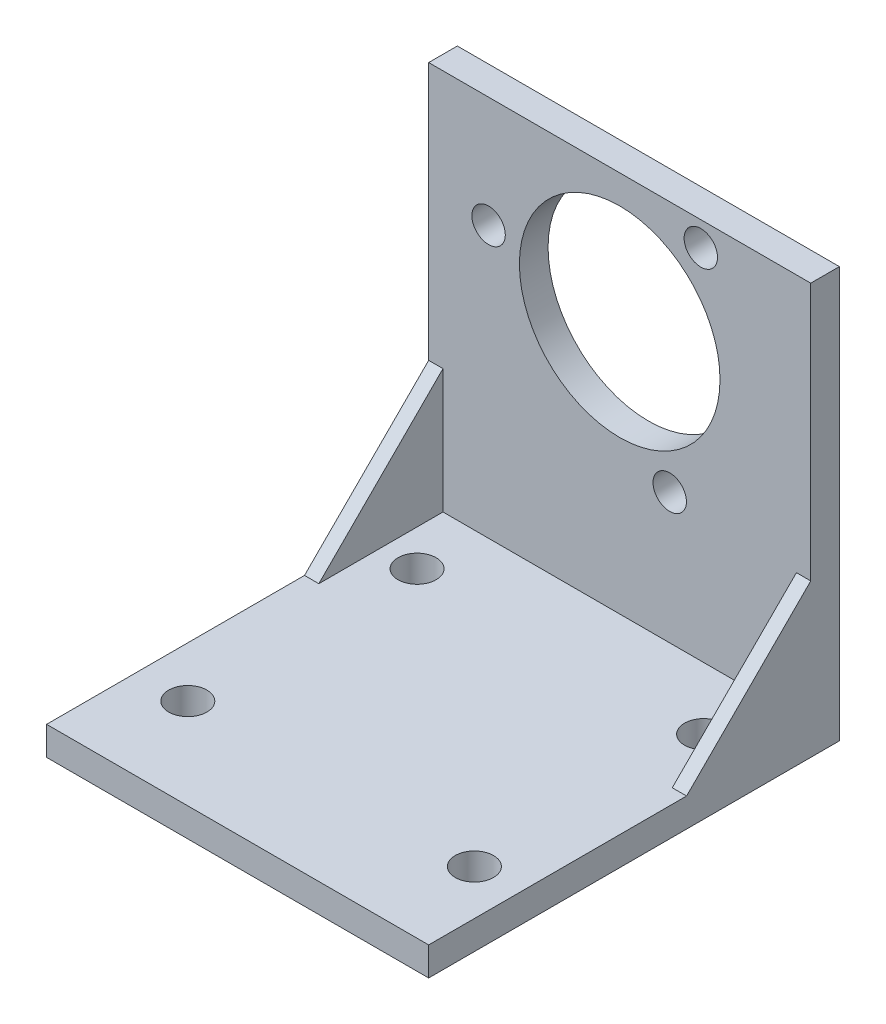
ISO-10303-21;
HEADER;
FILE_DESCRIPTION(('STEP AP214'),'2;1');
FILE_NAME('part.step','',(''),(''),'','','');
FILE_SCHEMA(('AUTOMOTIVE_DESIGN { 1 0 10303 214 1 1 1 1 }'));
ENDSEC;
DATA;
#1=APPLICATION_CONTEXT('core data for automotive mechanical design processes');
#2=APPLICATION_PROTOCOL_DEFINITION('international standard','automotive_design',2000,#1);
#3=PRODUCT_CONTEXT('',#1,'mechanical');
#4=PRODUCT('Part','Part','',(#3));
#5=PRODUCT_RELATED_PRODUCT_CATEGORY('part','',(#4));
#6=PRODUCT_DEFINITION_FORMATION('','',#4);
#7=PRODUCT_DEFINITION_CONTEXT('part definition',#1,'design');
#8=PRODUCT_DEFINITION('design','',#6,#7);
#9=PRODUCT_DEFINITION_SHAPE('','',#8);
#10=(LENGTH_UNIT() NAMED_UNIT(*) SI_UNIT(.MILLI.,.METRE.));
#11=(NAMED_UNIT(*) PLANE_ANGLE_UNIT() SI_UNIT($,.RADIAN.));
#12=(NAMED_UNIT(*) SI_UNIT($,.STERADIAN.) SOLID_ANGLE_UNIT());
#13=UNCERTAINTY_MEASURE_WITH_UNIT(LENGTH_MEASURE(1.E-05),#10,'distance_accuracy_value','');
#14=(GEOMETRIC_REPRESENTATION_CONTEXT(3) GLOBAL_UNCERTAINTY_ASSIGNED_CONTEXT((#13)) GLOBAL_UNIT_ASSIGNED_CONTEXT((#10,
#11,#12)) REPRESENTATION_CONTEXT('',''));
#15=CARTESIAN_POINT('',(0.,0.,0.));
#16=DIRECTION('',(0.,0.,1.));
#17=DIRECTION('',(1.,0.,0.));
#18=AXIS2_PLACEMENT_3D('',#15,#16,#17);
#19=CARTESIAN_POINT('',(0.,-3.,21.5));
#20=DIRECTION('',(0.,0.,1.));
#21=DIRECTION('',(1.,0.,0.));
#22=AXIS2_PLACEMENT_3D('',#19,#20,#21);
#23=PLANE('',#22);
#24=DIRECTION('',(1.,0.,0.));
#25=VECTOR('',#24,1.);
#26=CARTESIAN_POINT('',(0.,0.,21.5));
#27=LINE('',#26,#25);
#28=CARTESIAN_POINT('',(-20.,0.,21.5));
#29=VERTEX_POINT('',#28);
#30=CARTESIAN_POINT('',(20.,0.,21.5));
#31=VERTEX_POINT('',#30);
#32=EDGE_CURVE('E236',#29,#31,#27,.T.);
#33=ORIENTED_EDGE('',*,*,#32,.F.);
#34=DIRECTION('',(0.,1.,0.));
#35=VECTOR('',#34,1.);
#36=CARTESIAN_POINT('',(-20.,-3.,21.5));
#37=LINE('',#36,#35);
#38=CARTESIAN_POINT('',(-20.,-3.,21.5));
#39=VERTEX_POINT('',#38);
#40=EDGE_CURVE('E12',#39,#29,#37,.T.);
#41=ORIENTED_EDGE('',*,*,#40,.F.);
#42=DIRECTION('',(1.,0.,0.));
#43=VECTOR('',#42,1.);
#44=CARTESIAN_POINT('',(0.,-3.,21.5));
#45=LINE('',#44,#43);
#46=CARTESIAN_POINT('',(20.,-3.,21.5));
#47=VERTEX_POINT('',#46);
#48=EDGE_CURVE('E214',#39,#47,#45,.T.);
#49=ORIENTED_EDGE('',*,*,#48,.T.);
#50=DIRECTION('',(0.,1.,0.));
#51=VECTOR('',#50,1.);
#52=CARTESIAN_POINT('',(20.,-3.,21.5));
#53=LINE('',#52,#51);
#54=EDGE_CURVE('E54',#47,#31,#53,.T.);
#55=ORIENTED_EDGE('',*,*,#54,.T.);
#56=EDGE_LOOP('',(#33,#41,#49,#55));
#57=FACE_BOUND('',#56,.T.);
#58=ADVANCED_FACE('F50',(#57),#23,.T.);
#59=CARTESIAN_POINT('',(-20.,-3.,0.));
#60=DIRECTION('',(1.,0.,0.));
#61=DIRECTION('',(0.,0.,-1.));
#62=AXIS2_PLACEMENT_3D('',#59,#60,#61);
#63=PLANE('',#62);
#64=DIRECTION('',(0.,0.,-1.));
#65=VECTOR('',#64,1.);
#66=CARTESIAN_POINT('',(-20.,0.,0.));
#67=LINE('',#66,#65);
#68=CARTESIAN_POINT('',(-20.,0.,-5.5));
#69=VERTEX_POINT('',#68);
#70=EDGE_CURVE('E205',#29,#69,#67,.T.);
#71=ORIENTED_EDGE('',*,*,#70,.T.);
#72=DIRECTION('',(0.,0.707106781186547,-0.707106781186547));
#73=VECTOR('',#72,1.);
#74=CARTESIAN_POINT('',(-20.,13.,-18.5));
#75=LINE('',#74,#73);
#76=CARTESIAN_POINT('',(-20.,13.,-18.5));
#77=VERTEX_POINT('',#76);
#78=EDGE_CURVE('E257',#69,#77,#75,.T.);
#79=ORIENTED_EDGE('',*,*,#78,.T.);
#80=DIRECTION('',(0.,-1.,0.));
#81=VECTOR('',#80,1.);
#82=CARTESIAN_POINT('',(-20.,40.,-18.5));
#83=LINE('',#82,#81);
#84=CARTESIAN_POINT('',(-20.,40.,-18.5));
#85=VERTEX_POINT('',#84);
#86=EDGE_CURVE('E198',#85,#77,#83,.T.);
#87=ORIENTED_EDGE('',*,*,#86,.F.);
#88=DIRECTION('',(0.,0.,1.));
#89=VECTOR('',#88,1.);
#90=CARTESIAN_POINT('',(-20.,40.,0.));
#91=LINE('',#90,#89);
#92=CARTESIAN_POINT('',(-20.,40.,-21.5));
#93=VERTEX_POINT('',#92);
#94=EDGE_CURVE('E135',#93,#85,#91,.T.);
#95=ORIENTED_EDGE('',*,*,#94,.F.);
#96=DIRECTION('',(0.,1.,0.));
#97=VECTOR('',#96,1.);
#98=CARTESIAN_POINT('',(-20.,-3.,-21.5));
#99=LINE('',#98,#97);
#100=CARTESIAN_POINT('',(-20.,-3.,-21.5));
#101=VERTEX_POINT('',#100);
#102=EDGE_CURVE('E59',#101,#93,#99,.T.);
#103=ORIENTED_EDGE('',*,*,#102,.F.);
#104=DIRECTION('',(0.,0.,-1.));
#105=VECTOR('',#104,1.);
#106=CARTESIAN_POINT('',(-20.,-3.,0.));
#107=LINE('',#106,#105);
#108=EDGE_CURVE('E222',#39,#101,#107,.T.);
#109=ORIENTED_EDGE('',*,*,#108,.F.);
#110=ORIENTED_EDGE('',*,*,#40,.T.);
#111=EDGE_LOOP('',(#71,#79,#87,#95,#103,#109,#110));
#112=FACE_BOUND('',#111,.T.);
#113=ADVANCED_FACE('F255',(#112),#63,.F.);
#114=CARTESIAN_POINT('',(0.,-3.,-21.5));
#115=DIRECTION('',(0.,0.,1.));
#116=DIRECTION('',(1.,0.,0.));
#117=AXIS2_PLACEMENT_3D('',#114,#115,#116);
#118=PLANE('',#117);
#119=CARTESIAN_POINT('',(5.23636965743753,13.671109447397,-21.5));
#120=DIRECTION('',(0.,0.,1.));
#121=DIRECTION('',(1.,0.,0.));
#122=AXIS2_PLACEMENT_3D('',#119,#120,#121);
#123=CIRCLE('',#122,1.75);
#124=CARTESIAN_POINT('',(6.98636965743753,13.671109447397,-21.5));
#125=VERTEX_POINT('',#124);
#126=EDGE_CURVE('E136',#125,#125,#123,.T.);
#127=ORIENTED_EDGE('',*,*,#126,.T.);
#128=EDGE_LOOP('',(#127));
#129=FACE_BOUND('',#128,.T.);
#130=CARTESIAN_POINT('',(8.49196029220565,37.4492744232484,-21.5));
#131=DIRECTION('',(0.,0.,1.));
#132=DIRECTION('',(1.,0.,0.));
#133=AXIS2_PLACEMENT_3D('',#130,#131,#132);
#134=CIRCLE('',#133,1.75);
#135=CARTESIAN_POINT('',(10.2419602922057,37.4492744232484,-21.5));
#136=VERTEX_POINT('',#135);
#137=EDGE_CURVE('E180',#136,#136,#134,.T.);
#138=ORIENTED_EDGE('',*,*,#137,.T.);
#139=EDGE_LOOP('',(#138));
#140=FACE_BOUND('',#139,.T.);
#141=CARTESIAN_POINT('',(-13.7283299496432,28.3796161293546,-21.5));
#142=DIRECTION('',(0.,0.,1.));
#143=DIRECTION('',(1.,0.,0.));
#144=AXIS2_PLACEMENT_3D('',#141,#142,#143);
#145=CIRCLE('',#144,1.75);
#146=CARTESIAN_POINT('',(-11.9783299496432,28.3796161293546,-21.5));
#147=VERTEX_POINT('',#146);
#148=EDGE_CURVE('E177',#147,#147,#145,.T.);
#149=ORIENTED_EDGE('',*,*,#148,.T.);
#150=EDGE_LOOP('',(#149));
#151=FACE_BOUND('',#150,.T.);
#152=CARTESIAN_POINT('',(0.,26.5,-21.5));
#153=DIRECTION('',(0.,0.,1.));
#154=DIRECTION('',(1.,0.,0.));
#155=AXIS2_PLACEMENT_3D('',#152,#153,#154);
#156=CIRCLE('',#155,10.5);
#157=CARTESIAN_POINT('',(10.5,26.5,-21.5));
#158=VERTEX_POINT('',#157);
#159=EDGE_CURVE('E174',#158,#158,#156,.T.);
#160=ORIENTED_EDGE('',*,*,#159,.T.);
#161=EDGE_LOOP('',(#160));
#162=FACE_BOUND('',#161,.T.);
#163=ORIENTED_EDGE('',*,*,#102,.T.);
#164=DIRECTION('',(-1.,0.,0.));
#165=VECTOR('',#164,1.);
#166=CARTESIAN_POINT('',(0.,40.,-21.5));
#167=LINE('',#166,#165);
#168=CARTESIAN_POINT('',(20.,40.,-21.5));
#169=VERTEX_POINT('',#168);
#170=EDGE_CURVE('E192',#169,#93,#167,.T.);
#171=ORIENTED_EDGE('',*,*,#170,.F.);
#172=DIRECTION('',(0.,1.,0.));
#173=VECTOR('',#172,1.);
#174=CARTESIAN_POINT('',(20.,-3.,-21.5));
#175=LINE('',#174,#173);
#176=CARTESIAN_POINT('',(20.,-3.,-21.5));
#177=VERTEX_POINT('',#176);
#178=EDGE_CURVE('E242',#177,#169,#175,.T.);
#179=ORIENTED_EDGE('',*,*,#178,.F.);
#180=DIRECTION('',(1.,0.,0.));
#181=VECTOR('',#180,1.);
#182=CARTESIAN_POINT('',(0.,-3.,-21.5));
#183=LINE('',#182,#181);
#184=EDGE_CURVE('E220',#101,#177,#183,.T.);
#185=ORIENTED_EDGE('',*,*,#184,.F.);
#186=EDGE_LOOP('',(#163,#171,#179,#185));
#187=FACE_BOUND('',#186,.T.);
#188=ADVANCED_FACE('F283',(#129,#140,#151,#162,#187),#118,.F.);
#189=CARTESIAN_POINT('',(-14.7150530034863,-3.,-12.));
#190=DIRECTION('',(0.,1.,0.));
#191=DIRECTION('',(0.,0.,1.));
#192=AXIS2_PLACEMENT_3D('',#189,#190,#191);
#193=CYLINDRICAL_SURFACE('',#192,2.);
#194=CARTESIAN_POINT('',(-14.7150530034863,-3.,-12.));
#195=DIRECTION('',(0.,1.,0.));
#196=DIRECTION('',(0.,0.,1.));
#197=AXIS2_PLACEMENT_3D('',#194,#195,#196);
#198=CIRCLE('',#197,2.);
#199=CARTESIAN_POINT('',(-14.7150530034863,-3.,-10.));
#200=VERTEX_POINT('',#199);
#201=EDGE_CURVE('E211',#200,#200,#198,.T.);
#202=ORIENTED_EDGE('',*,*,#201,.F.);
#203=EDGE_LOOP('',(#202));
#204=FACE_BOUND('',#203,.T.);
#205=CARTESIAN_POINT('',(-14.7150530034863,0.,-12.));
#206=DIRECTION('',(0.,1.,0.));
#207=DIRECTION('',(0.,0.,1.));
#208=AXIS2_PLACEMENT_3D('',#205,#206,#207);
#209=CIRCLE('',#208,2.);
#210=CARTESIAN_POINT('',(-14.7150530034863,0.,-10.));
#211=VERTEX_POINT('',#210);
#212=EDGE_CURVE('E233',#211,#211,#209,.T.);
#213=ORIENTED_EDGE('',*,*,#212,.T.);
#214=EDGE_LOOP('',(#213));
#215=FACE_BOUND('',#214,.T.);
#216=ADVANCED_FACE('F288',(#204,#215),#193,.F.);
#217=CARTESIAN_POINT('',(15.2849469965137,-3.,-12.));
#218=DIRECTION('',(0.,1.,0.));
#219=DIRECTION('',(0.,0.,1.));
#220=AXIS2_PLACEMENT_3D('',#217,#218,#219);
#221=CYLINDRICAL_SURFACE('',#220,2.);
#222=CARTESIAN_POINT('',(15.2849469965137,-3.,-12.));
#223=DIRECTION('',(0.,1.,0.));
#224=DIRECTION('',(0.,0.,1.));
#225=AXIS2_PLACEMENT_3D('',#222,#223,#224);
#226=CIRCLE('',#225,2.);
#227=CARTESIAN_POINT('',(15.2849469965137,-3.,-9.99999999999999));
#228=VERTEX_POINT('',#227);
#229=EDGE_CURVE('E208',#228,#228,#226,.T.);
#230=ORIENTED_EDGE('',*,*,#229,.F.);
#231=EDGE_LOOP('',(#230));
#232=FACE_BOUND('',#231,.T.);
#233=CARTESIAN_POINT('',(15.2849469965137,0.,-12.));
#234=DIRECTION('',(0.,1.,0.));
#235=DIRECTION('',(0.,0.,1.));
#236=AXIS2_PLACEMENT_3D('',#233,#234,#235);
#237=CIRCLE('',#236,2.);
#238=CARTESIAN_POINT('',(15.2849469965137,0.,-9.99999999999999));
#239=VERTEX_POINT('',#238);
#240=EDGE_CURVE('E230',#239,#239,#237,.T.);
#241=ORIENTED_EDGE('',*,*,#240,.T.);
#242=EDGE_LOOP('',(#241));
#243=FACE_BOUND('',#242,.T.);
#244=ADVANCED_FACE('F291',(#232,#243),#221,.F.);
#245=CARTESIAN_POINT('',(-14.7150530034863,-3.,12.));
#246=DIRECTION('',(0.,1.,0.));
#247=DIRECTION('',(0.,0.,1.));
#248=AXIS2_PLACEMENT_3D('',#245,#246,#247);
#249=CYLINDRICAL_SURFACE('',#248,2.);
#250=CARTESIAN_POINT('',(-14.7150530034863,-3.,12.));
#251=DIRECTION('',(0.,1.,0.));
#252=DIRECTION('',(0.,0.,1.));
#253=AXIS2_PLACEMENT_3D('',#250,#251,#252);
#254=CIRCLE('',#253,2.);
#255=CARTESIAN_POINT('',(-14.7150530034863,-3.,14.));
#256=VERTEX_POINT('',#255);
#257=EDGE_CURVE('E204',#256,#256,#254,.T.);
#258=ORIENTED_EDGE('',*,*,#257,.F.);
#259=EDGE_LOOP('',(#258));
#260=FACE_BOUND('',#259,.T.);
#261=CARTESIAN_POINT('',(-14.7150530034863,0.,12.));
#262=DIRECTION('',(0.,1.,0.));
#263=DIRECTION('',(0.,0.,1.));
#264=AXIS2_PLACEMENT_3D('',#261,#262,#263);
#265=CIRCLE('',#264,2.);
#266=CARTESIAN_POINT('',(-14.7150530034863,0.,14.));
#267=VERTEX_POINT('',#266);
#268=EDGE_CURVE('E227',#267,#267,#265,.T.);
#269=ORIENTED_EDGE('',*,*,#268,.T.);
#270=EDGE_LOOP('',(#269));
#271=FACE_BOUND('',#270,.T.);
#272=ADVANCED_FACE('F294',(#260,#271),#249,.F.);
#273=CARTESIAN_POINT('',(15.2849469965137,-3.,12.));
#274=DIRECTION('',(0.,1.,0.));
#275=DIRECTION('',(0.,0.,1.));
#276=AXIS2_PLACEMENT_3D('',#273,#274,#275);
#277=CYLINDRICAL_SURFACE('',#276,2.);
#278=CARTESIAN_POINT('',(15.2849469965137,-3.,12.));
#279=DIRECTION('',(0.,1.,0.));
#280=DIRECTION('',(0.,0.,1.));
#281=AXIS2_PLACEMENT_3D('',#278,#279,#280);
#282=CIRCLE('',#281,2.);
#283=CARTESIAN_POINT('',(15.2849469965137,-3.,14.));
#284=VERTEX_POINT('',#283);
#285=EDGE_CURVE('E201',#284,#284,#282,.T.);
#286=ORIENTED_EDGE('',*,*,#285,.F.);
#287=EDGE_LOOP('',(#286));
#288=FACE_BOUND('',#287,.T.);
#289=CARTESIAN_POINT('',(15.2849469965137,0.,12.));
#290=DIRECTION('',(0.,1.,0.));
#291=DIRECTION('',(0.,0.,1.));
#292=AXIS2_PLACEMENT_3D('',#289,#290,#291);
#293=CIRCLE('',#292,2.);
#294=CARTESIAN_POINT('',(15.2849469965137,0.,14.));
#295=VERTEX_POINT('',#294);
#296=EDGE_CURVE('E200',#295,#295,#293,.T.);
#297=ORIENTED_EDGE('',*,*,#296,.T.);
#298=EDGE_LOOP('',(#297));
#299=FACE_BOUND('',#298,.T.);
#300=ADVANCED_FACE('F52',(#288,#299),#277,.F.);
#301=CARTESIAN_POINT('',(20.,-3.,0.));
#302=DIRECTION('',(1.,0.,0.));
#303=DIRECTION('',(0.,0.,-1.));
#304=AXIS2_PLACEMENT_3D('',#301,#302,#303);
#305=PLANE('',#304);
#306=DIRECTION('',(0.,0.,-1.));
#307=VECTOR('',#306,1.);
#308=CARTESIAN_POINT('',(20.,0.,0.));
#309=LINE('',#308,#307);
#310=CARTESIAN_POINT('',(20.,0.,-5.5));
#311=VERTEX_POINT('',#310);
#312=EDGE_CURVE('E239',#31,#311,#309,.T.);
#313=ORIENTED_EDGE('',*,*,#312,.F.);
#314=ORIENTED_EDGE('',*,*,#54,.F.);
#315=DIRECTION('',(0.,0.,-1.));
#316=VECTOR('',#315,1.);
#317=CARTESIAN_POINT('',(20.,-3.,0.));
#318=LINE('',#317,#316);
#319=EDGE_CURVE('E217',#47,#177,#318,.T.);
#320=ORIENTED_EDGE('',*,*,#319,.T.);
#321=ORIENTED_EDGE('',*,*,#178,.T.);
#322=DIRECTION('',(0.,0.,-1.));
#323=VECTOR('',#322,1.);
#324=CARTESIAN_POINT('',(20.,40.,0.));
#325=LINE('',#324,#323);
#326=CARTESIAN_POINT('',(20.,40.,-18.5));
#327=VERTEX_POINT('',#326);
#328=EDGE_CURVE('E189',#327,#169,#325,.T.);
#329=ORIENTED_EDGE('',*,*,#328,.F.);
#330=DIRECTION('',(0.,-1.,0.));
#331=VECTOR('',#330,1.);
#332=CARTESIAN_POINT('',(20.,40.,-18.5));
#333=LINE('',#332,#331);
#334=CARTESIAN_POINT('',(20.,13.,-18.5));
#335=VERTEX_POINT('',#334);
#336=EDGE_CURVE('E194',#327,#335,#333,.T.);
#337=ORIENTED_EDGE('',*,*,#336,.T.);
#338=DIRECTION('',(0.,-0.707106781186547,0.707106781186547));
#339=VECTOR('',#338,1.);
#340=CARTESIAN_POINT('',(20.,13.,-18.5));
#341=LINE('',#340,#339);
#342=EDGE_CURVE('E150',#335,#311,#341,.T.);
#343=ORIENTED_EDGE('',*,*,#342,.T.);
#344=EDGE_LOOP('',(#313,#314,#320,#321,#329,#337,#343));
#345=FACE_BOUND('',#344,.T.);
#346=ADVANCED_FACE('F251',(#345),#305,.T.);
#347=CARTESIAN_POINT('',(0.,-3.,0.));
#348=DIRECTION('',(0.,1.,0.));
#349=DIRECTION('',(0.,0.,1.));
#350=AXIS2_PLACEMENT_3D('',#347,#348,#349);
#351=PLANE('',#350);
#352=ORIENTED_EDGE('',*,*,#285,.T.);
#353=EDGE_LOOP('',(#352));
#354=FACE_BOUND('',#353,.T.);
#355=ORIENTED_EDGE('',*,*,#257,.T.);
#356=EDGE_LOOP('',(#355));
#357=FACE_BOUND('',#356,.T.);
#358=ORIENTED_EDGE('',*,*,#229,.T.);
#359=EDGE_LOOP('',(#358));
#360=FACE_BOUND('',#359,.T.);
#361=ORIENTED_EDGE('',*,*,#201,.T.);
#362=EDGE_LOOP('',(#361));
#363=FACE_BOUND('',#362,.T.);
#364=ORIENTED_EDGE('',*,*,#48,.F.);
#365=ORIENTED_EDGE('',*,*,#108,.T.);
#366=ORIENTED_EDGE('',*,*,#184,.T.);
#367=ORIENTED_EDGE('',*,*,#319,.F.);
#368=EDGE_LOOP('',(#364,#365,#366,#367));
#369=FACE_BOUND('',#368,.T.);
#370=ADVANCED_FACE('F308',(#354,#357,#360,#363,#369),#351,.F.);
#371=CARTESIAN_POINT('',(0.,0.,0.));
#372=DIRECTION('',(0.,1.,0.));
#373=DIRECTION('',(0.,0.,1.));
#374=AXIS2_PLACEMENT_3D('',#371,#372,#373);
#375=PLANE('',#374);
#376=DIRECTION('',(-1.,0.,0.));
#377=VECTOR('',#376,1.);
#378=CARTESIAN_POINT('',(-18.5,0.,-5.5));
#379=LINE('',#378,#377);
#380=CARTESIAN_POINT('',(-18.5,0.,-5.5));
#381=VERTEX_POINT('',#380);
#382=EDGE_CURVE('E71',#381,#69,#379,.T.);
#383=ORIENTED_EDGE('',*,*,#382,.T.);
#384=ORIENTED_EDGE('',*,*,#70,.F.);
#385=ORIENTED_EDGE('',*,*,#32,.T.);
#386=ORIENTED_EDGE('',*,*,#312,.T.);
#387=DIRECTION('',(1.,0.,0.));
#388=VECTOR('',#387,1.);
#389=CARTESIAN_POINT('',(18.5,0.,-5.5));
#390=LINE('',#389,#388);
#391=CARTESIAN_POINT('',(18.5,0.,-5.5));
#392=VERTEX_POINT('',#391);
#393=EDGE_CURVE('E149',#392,#311,#390,.T.);
#394=ORIENTED_EDGE('',*,*,#393,.F.);
#395=DIRECTION('',(0.,0.,-1.));
#396=VECTOR('',#395,1.);
#397=CARTESIAN_POINT('',(18.5,0.,-18.5));
#398=LINE('',#397,#396);
#399=CARTESIAN_POINT('',(18.5,0.,-18.5));
#400=VERTEX_POINT('',#399);
#401=EDGE_CURVE('E141',#392,#400,#398,.T.);
#402=ORIENTED_EDGE('',*,*,#401,.T.);
#403=DIRECTION('',(1.,0.,0.));
#404=VECTOR('',#403,1.);
#405=CARTESIAN_POINT('',(0.,0.,-18.5));
#406=LINE('',#405,#404);
#407=CARTESIAN_POINT('',(-18.5,0.,-18.5));
#408=VERTEX_POINT('',#407);
#409=EDGE_CURVE('E127',#408,#400,#406,.T.);
#410=ORIENTED_EDGE('',*,*,#409,.F.);
#411=DIRECTION('',(0.,0.,1.));
#412=VECTOR('',#411,1.);
#413=CARTESIAN_POINT('',(-18.5,0.,-18.5));
#414=LINE('',#413,#412);
#415=EDGE_CURVE('E67',#408,#381,#414,.T.);
#416=ORIENTED_EDGE('',*,*,#415,.T.);
#417=EDGE_LOOP('',(#383,#384,#385,#386,#394,#402,#410,#416));
#418=FACE_BOUND('',#417,.T.);
#419=ORIENTED_EDGE('',*,*,#296,.F.);
#420=EDGE_LOOP('',(#419));
#421=FACE_BOUND('',#420,.T.);
#422=ORIENTED_EDGE('',*,*,#268,.F.);
#423=EDGE_LOOP('',(#422));
#424=FACE_BOUND('',#423,.T.);
#425=ORIENTED_EDGE('',*,*,#240,.F.);
#426=EDGE_LOOP('',(#425));
#427=FACE_BOUND('',#426,.T.);
#428=ORIENTED_EDGE('',*,*,#212,.F.);
#429=EDGE_LOOP('',(#428));
#430=FACE_BOUND('',#429,.T.);
#431=ADVANCED_FACE('F146',(#418,#421,#424,#427,#430),#375,.T.);
#432=CARTESIAN_POINT('',(0.,40.,-18.5));
#433=DIRECTION('',(0.,0.,-1.));
#434=DIRECTION('',(-1.,0.,0.));
#435=AXIS2_PLACEMENT_3D('',#432,#433,#434);
#436=PLANE('',#435);
#437=CARTESIAN_POINT('',(5.23636965743753,13.671109447397,-18.5));
#438=DIRECTION('',(0.,0.,1.));
#439=DIRECTION('',(1.,0.,0.));
#440=AXIS2_PLACEMENT_3D('',#437,#438,#439);
#441=CIRCLE('',#440,1.75);
#442=CARTESIAN_POINT('',(6.98636965743753,13.671109447397,-18.5));
#443=VERTEX_POINT('',#442);
#444=EDGE_CURVE('E161',#443,#443,#441,.T.);
#445=ORIENTED_EDGE('',*,*,#444,.F.);
#446=EDGE_LOOP('',(#445));
#447=FACE_BOUND('',#446,.T.);
#448=CARTESIAN_POINT('',(8.49196029220565,37.4492744232484,-18.5));
#449=DIRECTION('',(0.,0.,1.));
#450=DIRECTION('',(1.,0.,0.));
#451=AXIS2_PLACEMENT_3D('',#448,#449,#450);
#452=CIRCLE('',#451,1.75);
#453=CARTESIAN_POINT('',(10.2419602922057,37.4492744232484,-18.5));
#454=VERTEX_POINT('',#453);
#455=EDGE_CURVE('E167',#454,#454,#452,.T.);
#456=ORIENTED_EDGE('',*,*,#455,.F.);
#457=EDGE_LOOP('',(#456));
#458=FACE_BOUND('',#457,.T.);
#459=CARTESIAN_POINT('',(-13.7283299496432,28.3796161293546,-18.5));
#460=DIRECTION('',(0.,0.,1.));
#461=DIRECTION('',(1.,0.,0.));
#462=AXIS2_PLACEMENT_3D('',#459,#460,#461);
#463=CIRCLE('',#462,1.75);
#464=CARTESIAN_POINT('',(-11.9783299496432,28.3796161293546,-18.5));
#465=VERTEX_POINT('',#464);
#466=EDGE_CURVE('E163',#465,#465,#463,.T.);
#467=ORIENTED_EDGE('',*,*,#466,.F.);
#468=EDGE_LOOP('',(#467));
#469=FACE_BOUND('',#468,.T.);
#470=CARTESIAN_POINT('',(0.,26.5,-18.5));
#471=DIRECTION('',(0.,0.,1.));
#472=DIRECTION('',(1.,0.,0.));
#473=AXIS2_PLACEMENT_3D('',#470,#471,#472);
#474=CIRCLE('',#473,10.5);
#475=CARTESIAN_POINT('',(10.5,26.5,-18.5));
#476=VERTEX_POINT('',#475);
#477=EDGE_CURVE('E166',#476,#476,#474,.T.);
#478=ORIENTED_EDGE('',*,*,#477,.F.);
#479=EDGE_LOOP('',(#478));
#480=FACE_BOUND('',#479,.T.);
#481=ORIENTED_EDGE('',*,*,#86,.T.);
#482=DIRECTION('',(-1.,0.,0.));
#483=VECTOR('',#482,1.);
#484=CARTESIAN_POINT('',(-18.5,13.,-18.5));
#485=LINE('',#484,#483);
#486=CARTESIAN_POINT('',(-18.5,13.,-18.5));
#487=VERTEX_POINT('',#486);
#488=EDGE_CURVE('E153',#487,#77,#485,.T.);
#489=ORIENTED_EDGE('',*,*,#488,.F.);
#490=DIRECTION('',(0.,-1.,0.));
#491=VECTOR('',#490,1.);
#492=CARTESIAN_POINT('',(-18.5,0.,-18.5));
#493=LINE('',#492,#491);
#494=EDGE_CURVE('E133',#487,#408,#493,.T.);
#495=ORIENTED_EDGE('',*,*,#494,.T.);
#496=ORIENTED_EDGE('',*,*,#409,.T.);
#497=DIRECTION('',(0.,1.,0.));
#498=VECTOR('',#497,1.);
#499=CARTESIAN_POINT('',(18.5,0.,-18.5));
#500=LINE('',#499,#498);
#501=CARTESIAN_POINT('',(18.5,13.,-18.5));
#502=VERTEX_POINT('',#501);
#503=EDGE_CURVE('E131',#400,#502,#500,.T.);
#504=ORIENTED_EDGE('',*,*,#503,.T.);
#505=DIRECTION('',(1.,0.,0.));
#506=VECTOR('',#505,1.);
#507=CARTESIAN_POINT('',(18.5,13.,-18.5));
#508=LINE('',#507,#506);
#509=EDGE_CURVE('E158',#502,#335,#508,.T.);
#510=ORIENTED_EDGE('',*,*,#509,.T.);
#511=ORIENTED_EDGE('',*,*,#336,.F.);
#512=DIRECTION('',(1.,0.,0.));
#513=VECTOR('',#512,1.);
#514=CARTESIAN_POINT('',(0.,40.,-18.5));
#515=LINE('',#514,#513);
#516=EDGE_CURVE('E187',#85,#327,#515,.T.);
#517=ORIENTED_EDGE('',*,*,#516,.F.);
#518=EDGE_LOOP('',(#481,#489,#495,#496,#504,#510,#511,#517));
#519=FACE_BOUND('',#518,.T.);
#520=ADVANCED_FACE('F129',(#447,#458,#469,#480,#519),#436,.F.);
#521=CARTESIAN_POINT('',(0.,40.,0.));
#522=DIRECTION('',(0.,1.,0.));
#523=DIRECTION('',(0.,0.,1.));
#524=AXIS2_PLACEMENT_3D('',#521,#522,#523);
#525=PLANE('',#524);
#526=ORIENTED_EDGE('',*,*,#94,.T.);
#527=ORIENTED_EDGE('',*,*,#516,.T.);
#528=ORIENTED_EDGE('',*,*,#328,.T.);
#529=ORIENTED_EDGE('',*,*,#170,.T.);
#530=EDGE_LOOP('',(#526,#527,#528,#529));
#531=FACE_BOUND('',#530,.T.);
#532=ADVANCED_FACE('F319',(#531),#525,.T.);
#533=CARTESIAN_POINT('',(0.,26.5,-42.5));
#534=DIRECTION('',(0.,0.,1.));
#535=DIRECTION('',(1.,0.,0.));
#536=AXIS2_PLACEMENT_3D('',#533,#534,#535);
#537=CYLINDRICAL_SURFACE('',#536,10.5);
#538=ORIENTED_EDGE('',*,*,#477,.T.);
#539=EDGE_LOOP('',(#538));
#540=FACE_BOUND('',#539,.T.);
#541=ORIENTED_EDGE('',*,*,#159,.F.);
#542=EDGE_LOOP('',(#541));
#543=FACE_BOUND('',#542,.T.);
#544=ADVANCED_FACE('F359',(#540,#543),#537,.F.);
#545=CARTESIAN_POINT('',(-13.7283299496432,28.3796161293546,-42.5));
#546=DIRECTION('',(0.,0.,1.));
#547=DIRECTION('',(1.,0.,0.));
#548=AXIS2_PLACEMENT_3D('',#545,#546,#547);
#549=CYLINDRICAL_SURFACE('',#548,1.75);
#550=ORIENTED_EDGE('',*,*,#466,.T.);
#551=EDGE_LOOP('',(#550));
#552=FACE_BOUND('',#551,.T.);
#553=ORIENTED_EDGE('',*,*,#148,.F.);
#554=EDGE_LOOP('',(#553));
#555=FACE_BOUND('',#554,.T.);
#556=ADVANCED_FACE('F356',(#552,#555),#549,.F.);
#557=CARTESIAN_POINT('',(8.49196029220565,37.4492744232484,-42.5));
#558=DIRECTION('',(0.,0.,1.));
#559=DIRECTION('',(1.,0.,0.));
#560=AXIS2_PLACEMENT_3D('',#557,#558,#559);
#561=CYLINDRICAL_SURFACE('',#560,1.75);
#562=ORIENTED_EDGE('',*,*,#455,.T.);
#563=EDGE_LOOP('',(#562));
#564=FACE_BOUND('',#563,.T.);
#565=ORIENTED_EDGE('',*,*,#137,.F.);
#566=EDGE_LOOP('',(#565));
#567=FACE_BOUND('',#566,.T.);
#568=ADVANCED_FACE('F352',(#564,#567),#561,.F.);
#569=CARTESIAN_POINT('',(5.23636965743753,13.671109447397,-42.5));
#570=DIRECTION('',(0.,0.,1.));
#571=DIRECTION('',(1.,0.,0.));
#572=AXIS2_PLACEMENT_3D('',#569,#570,#571);
#573=CYLINDRICAL_SURFACE('',#572,1.75);
#574=ORIENTED_EDGE('',*,*,#444,.T.);
#575=EDGE_LOOP('',(#574));
#576=FACE_BOUND('',#575,.T.);
#577=ORIENTED_EDGE('',*,*,#126,.F.);
#578=EDGE_LOOP('',(#577));
#579=FACE_BOUND('',#578,.T.);
#580=ADVANCED_FACE('F344',(#576,#579),#573,.F.);
#581=CARTESIAN_POINT('',(18.5,13.,-18.5));
#582=DIRECTION('',(0.,0.707106781186548,0.707106781186548));
#583=DIRECTION('',(0.,-0.707106781186548,0.707106781186548));
#584=AXIS2_PLACEMENT_3D('',#581,#582,#583);
#585=PLANE('',#584);
#586=ORIENTED_EDGE('',*,*,#342,.F.);
#587=ORIENTED_EDGE('',*,*,#509,.F.);
#588=DIRECTION('',(0.,-0.707106781186547,0.707106781186547));
#589=VECTOR('',#588,1.);
#590=CARTESIAN_POINT('',(18.5,13.,-18.5));
#591=LINE('',#590,#589);
#592=EDGE_CURVE('E143',#502,#392,#591,.T.);
#593=ORIENTED_EDGE('',*,*,#592,.T.);
#594=ORIENTED_EDGE('',*,*,#393,.T.);
#595=EDGE_LOOP('',(#586,#587,#593,#594));
#596=FACE_BOUND('',#595,.T.);
#597=ADVANCED_FACE('F342',(#596),#585,.T.);
#598=CARTESIAN_POINT('',(18.5,0.,0.));
#599=DIRECTION('',(-1.,0.,0.));
#600=DIRECTION('',(0.,0.,1.));
#601=AXIS2_PLACEMENT_3D('',#598,#599,#600);
#602=PLANE('',#601);
#603=ORIENTED_EDGE('',*,*,#401,.F.);
#604=ORIENTED_EDGE('',*,*,#592,.F.);
#605=ORIENTED_EDGE('',*,*,#503,.F.);
#606=EDGE_LOOP('',(#603,#604,#605));
#607=FACE_BOUND('',#606,.T.);
#608=ADVANCED_FACE('F140',(#607),#602,.T.);
#609=CARTESIAN_POINT('',(-18.5,13.,-18.5));
#610=DIRECTION('',(0.,0.707106781186548,0.707106781186548));
#611=DIRECTION('',(0.,-0.707106781186548,0.707106781186548));
#612=AXIS2_PLACEMENT_3D('',#609,#610,#611);
#613=PLANE('',#612);
#614=ORIENTED_EDGE('',*,*,#78,.F.);
#615=ORIENTED_EDGE('',*,*,#382,.F.);
#616=DIRECTION('',(0.,0.707106781186547,-0.707106781186547));
#617=VECTOR('',#616,1.);
#618=CARTESIAN_POINT('',(-18.5,13.,-18.5));
#619=LINE('',#618,#617);
#620=EDGE_CURVE('E265',#381,#487,#619,.T.);
#621=ORIENTED_EDGE('',*,*,#620,.T.);
#622=ORIENTED_EDGE('',*,*,#488,.T.);
#623=EDGE_LOOP('',(#614,#615,#621,#622));
#624=FACE_BOUND('',#623,.T.);
#625=ADVANCED_FACE('F261',(#624),#613,.T.);
#626=CARTESIAN_POINT('',(-18.5,0.,0.));
#627=DIRECTION('',(-1.,0.,0.));
#628=DIRECTION('',(0.,0.,1.));
#629=AXIS2_PLACEMENT_3D('',#626,#627,#628);
#630=PLANE('',#629);
#631=ORIENTED_EDGE('',*,*,#415,.F.);
#632=ORIENTED_EDGE('',*,*,#494,.F.);
#633=ORIENTED_EDGE('',*,*,#620,.F.);
#634=EDGE_LOOP('',(#631,#632,#633));
#635=FACE_BOUND('',#634,.T.);
#636=ADVANCED_FACE('F270',(#635),#630,.F.);
#637=CLOSED_SHELL('',(#58,#113,#188,#216,#244,#272,#300,#346,#370,#431,#520,#532,#544,#556,#568,
#580,#597,#608,#625,#636));
#638=MANIFOLD_SOLID_BREP('B2',#637);
#639=ADVANCED_BREP_SHAPE_REPRESENTATION('',(#18,#638),#14);
#640=SHAPE_DEFINITION_REPRESENTATION(#9,#639);
ENDSEC;
END-ISO-10303-21;
